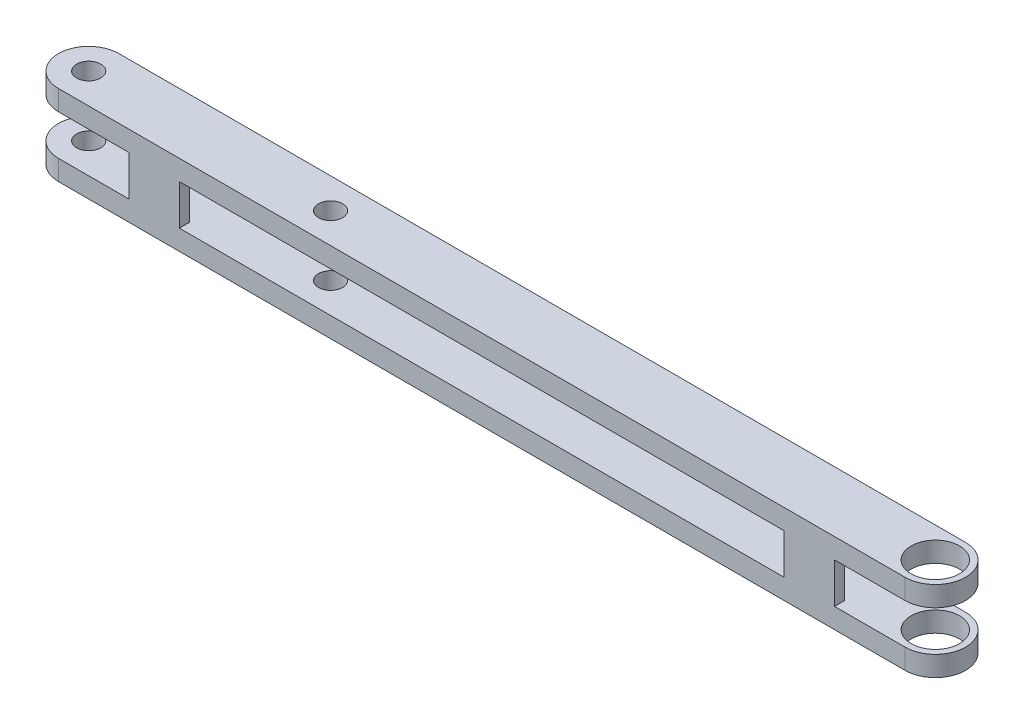
ISO-10303-21;
HEADER;
FILE_DESCRIPTION(('STEP AP214'),'2;1');
FILE_NAME('part.step','',(''),(''),'','','');
FILE_SCHEMA(('AUTOMOTIVE_DESIGN { 1 0 10303 214 1 1 1 1 }'));
ENDSEC;
DATA;
#1=APPLICATION_CONTEXT('core data for automotive mechanical design processes');
#2=APPLICATION_PROTOCOL_DEFINITION('international standard','automotive_design',2000,#1);
#3=PRODUCT_CONTEXT('',#1,'mechanical');
#4=PRODUCT('Part','Part','',(#3));
#5=PRODUCT_RELATED_PRODUCT_CATEGORY('part','',(#4));
#6=PRODUCT_DEFINITION_FORMATION('','',#4);
#7=PRODUCT_DEFINITION_CONTEXT('part definition',#1,'design');
#8=PRODUCT_DEFINITION('design','',#6,#7);
#9=PRODUCT_DEFINITION_SHAPE('','',#8);
#10=(LENGTH_UNIT() NAMED_UNIT(*) SI_UNIT(.MILLI.,.METRE.));
#11=(NAMED_UNIT(*) PLANE_ANGLE_UNIT() SI_UNIT($,.RADIAN.));
#12=(NAMED_UNIT(*) SI_UNIT($,.STERADIAN.) SOLID_ANGLE_UNIT());
#13=UNCERTAINTY_MEASURE_WITH_UNIT(LENGTH_MEASURE(1.E-05),#10,'distance_accuracy_value','');
#14=(GEOMETRIC_REPRESENTATION_CONTEXT(3) GLOBAL_UNCERTAINTY_ASSIGNED_CONTEXT((#13)) GLOBAL_UNIT_ASSIGNED_CONTEXT((#10,
#11,#12)) REPRESENTATION_CONTEXT('',''));
#15=CARTESIAN_POINT('',(0.,0.,0.));
#16=DIRECTION('',(0.,0.,1.));
#17=DIRECTION('',(1.,0.,0.));
#18=AXIS2_PLACEMENT_3D('',#15,#16,#17);
#19=CARTESIAN_POINT('',(75.,4.99999999999999,7.50000000000001));
#20=DIRECTION('',(1.,0.,0.));
#21=DIRECTION('',(0.,0.,-1.));
#22=AXIS2_PLACEMENT_3D('',#19,#20,#21);
#23=PLANE('',#22);
#24=DIRECTION('',(0.,0.,-1.));
#25=VECTOR('',#24,1.);
#26=CARTESIAN_POINT('',(75.,4.99999999999999,7.50000000000001));
#27=LINE('',#26,#25);
#28=CARTESIAN_POINT('',(75.,4.99999999999999,-5.));
#29=VERTEX_POINT('',#28);
#30=CARTESIAN_POINT('',(75.,4.99999999999999,-7.50000000000003));
#31=VERTEX_POINT('',#30);
#32=EDGE_CURVE('E275',#29,#31,#27,.T.);
#33=ORIENTED_EDGE('',*,*,#32,.F.);
#34=DIRECTION('',(0.,1.,0.));
#35=VECTOR('',#34,1.);
#36=CARTESIAN_POINT('',(75.,4.99999999999999,-5.00000000000002));
#37=LINE('',#36,#35);
#38=CARTESIAN_POINT('',(75.,15.,-5.00000000000001));
#39=VERTEX_POINT('',#38);
#40=EDGE_CURVE('E245',#29,#39,#37,.T.);
#41=ORIENTED_EDGE('',*,*,#40,.T.);
#42=DIRECTION('',(0.,0.,-1.));
#43=VECTOR('',#42,1.);
#44=CARTESIAN_POINT('',(75.,15.,7.50000000000001));
#45=LINE('',#44,#43);
#46=CARTESIAN_POINT('',(75.,15.,-7.50000000000003));
#47=VERTEX_POINT('',#46);
#48=EDGE_CURVE('E290',#39,#47,#45,.T.);
#49=ORIENTED_EDGE('',*,*,#48,.T.);
#50=DIRECTION('',(0.,-1.,0.));
#51=VECTOR('',#50,1.);
#52=CARTESIAN_POINT('',(75.,4.99999999999999,-7.50000000000003));
#53=LINE('',#52,#51);
#54=EDGE_CURVE('E261',#47,#31,#53,.T.);
#55=ORIENTED_EDGE('',*,*,#54,.T.);
#56=EDGE_LOOP('',(#33,#41,#49,#55));
#57=FACE_BOUND('',#56,.T.);
#58=ADVANCED_FACE('F35',(#57),#23,.F.);
#59=CARTESIAN_POINT('',(-75.,5.00000000000002,7.50000000000003));
#60=DIRECTION('',(-1.,0.,0.));
#61=DIRECTION('',(0.,0.,1.));
#62=AXIS2_PLACEMENT_3D('',#59,#60,#61);
#63=PLANE('',#62);
#64=DIRECTION('',(0.,0.,-1.));
#65=VECTOR('',#64,1.);
#66=CARTESIAN_POINT('',(-75.,15.,7.50000000000003));
#67=LINE('',#66,#65);
#68=CARTESIAN_POINT('',(-75.,15.,-4.99999999999999));
#69=VERTEX_POINT('',#68);
#70=CARTESIAN_POINT('',(-75.,15.,-7.50000000000001));
#71=VERTEX_POINT('',#70);
#72=EDGE_CURVE('E294',#69,#71,#67,.T.);
#73=ORIENTED_EDGE('',*,*,#72,.F.);
#74=DIRECTION('',(0.,-1.,0.));
#75=VECTOR('',#74,1.);
#76=CARTESIAN_POINT('',(-75.,5.00000000000001,-4.99999999999999));
#77=LINE('',#76,#75);
#78=CARTESIAN_POINT('',(-75.,4.99999999999998,-4.99999999999999));
#79=VERTEX_POINT('',#78);
#80=EDGE_CURVE('E376',#69,#79,#77,.T.);
#81=ORIENTED_EDGE('',*,*,#80,.T.);
#82=DIRECTION('',(0.,0.,-1.));
#83=VECTOR('',#82,1.);
#84=CARTESIAN_POINT('',(-75.,5.00000000000002,7.50000000000003));
#85=LINE('',#84,#83);
#86=CARTESIAN_POINT('',(-75.,5.00000000000002,-7.50000000000001));
#87=VERTEX_POINT('',#86);
#88=EDGE_CURVE('E297',#79,#87,#85,.T.);
#89=ORIENTED_EDGE('',*,*,#88,.T.);
#90=DIRECTION('',(0.,1.,0.));
#91=VECTOR('',#90,1.);
#92=CARTESIAN_POINT('',(-75.,5.00000000000002,-7.50000000000001));
#93=LINE('',#92,#91);
#94=EDGE_CURVE('E281',#87,#71,#93,.T.);
#95=ORIENTED_EDGE('',*,*,#94,.T.);
#96=EDGE_LOOP('',(#73,#81,#89,#95));
#97=FACE_BOUND('',#96,.T.);
#98=ADVANCED_FACE('F461',(#97),#63,.F.);
#99=CARTESIAN_POINT('',(87.5,15.,7.50000000000004));
#100=DIRECTION('',(-1.,0.,0.));
#101=DIRECTION('',(0.,0.,1.));
#102=AXIS2_PLACEMENT_3D('',#99,#100,#101);
#103=PLANE('',#102);
#104=DIRECTION('',(0.,0.,-1.));
#105=VECTOR('',#104,1.);
#106=CARTESIAN_POINT('',(87.5,15.,7.50000000000004));
#107=LINE('',#106,#105);
#108=CARTESIAN_POINT('',(87.5,15.,-5.00000000000002));
#109=VERTEX_POINT('',#108);
#110=CARTESIAN_POINT('',(87.5,15.,-7.50000000000003));
#111=VERTEX_POINT('',#110);
#112=EDGE_CURVE('E252',#109,#111,#107,.T.);
#113=ORIENTED_EDGE('',*,*,#112,.F.);
#114=DIRECTION('',(0.,-1.,0.));
#115=VECTOR('',#114,1.);
#116=CARTESIAN_POINT('',(87.5,15.,-5.00000000000002));
#117=LINE('',#116,#115);
#118=CARTESIAN_POINT('',(87.5,4.99999999999998,-5.00000000000002));
#119=VERTEX_POINT('',#118);
#120=EDGE_CURVE('E373',#109,#119,#117,.T.);
#121=ORIENTED_EDGE('',*,*,#120,.T.);
#122=DIRECTION('',(0.,0.,-1.));
#123=VECTOR('',#122,1.);
#124=CARTESIAN_POINT('',(87.5,4.99999999999998,7.50000000000004));
#125=LINE('',#124,#123);
#126=CARTESIAN_POINT('',(87.5,4.99999999999998,-7.50000000000003));
#127=VERTEX_POINT('',#126);
#128=EDGE_CURVE('E241',#119,#127,#125,.T.);
#129=ORIENTED_EDGE('',*,*,#128,.T.);
#130=DIRECTION('',(0.,1.,0.));
#131=VECTOR('',#130,1.);
#132=CARTESIAN_POINT('',(87.5,15.,-7.50000000000003));
#133=LINE('',#132,#131);
#134=EDGE_CURVE('E235',#127,#111,#133,.T.);
#135=ORIENTED_EDGE('',*,*,#134,.T.);
#136=EDGE_LOOP('',(#113,#121,#129,#135));
#137=FACE_BOUND('',#136,.T.);
#138=ADVANCED_FACE('F467',(#137),#103,.F.);
#139=CARTESIAN_POINT('',(-87.5,15.,7.50000000000007));
#140=DIRECTION('',(1.,0.,0.));
#141=DIRECTION('',(0.,0.,-1.));
#142=AXIS2_PLACEMENT_3D('',#139,#140,#141);
#143=PLANE('',#142);
#144=DIRECTION('',(0.,0.,-1.));
#145=VECTOR('',#144,1.);
#146=CARTESIAN_POINT('',(-87.5,4.99999999999998,7.50000000000007));
#147=LINE('',#146,#145);
#148=CARTESIAN_POINT('',(-87.5,4.99999999999998,-5.00000000000002));
#149=VERTEX_POINT('',#148);
#150=CARTESIAN_POINT('',(-87.5,4.99999999999998,-7.5));
#151=VERTEX_POINT('',#150);
#152=EDGE_CURVE('E221',#149,#151,#147,.T.);
#153=ORIENTED_EDGE('',*,*,#152,.F.);
#154=DIRECTION('',(0.,-1.,0.));
#155=VECTOR('',#154,1.);
#156=CARTESIAN_POINT('',(-87.5,15.,-4.99999999999998));
#157=LINE('',#156,#155);
#158=CARTESIAN_POINT('',(-87.5,15.,-4.99999999999998));
#159=VERTEX_POINT('',#158);
#160=EDGE_CURVE('E213',#159,#149,#157,.T.);
#161=ORIENTED_EDGE('',*,*,#160,.F.);
#162=DIRECTION('',(0.,0.,-1.));
#163=VECTOR('',#162,1.);
#164=CARTESIAN_POINT('',(-87.5,15.,7.50000000000007));
#165=LINE('',#164,#163);
#166=CARTESIAN_POINT('',(-87.5,15.,-7.5));
#167=VERTEX_POINT('',#166);
#168=EDGE_CURVE('E230',#159,#167,#165,.T.);
#169=ORIENTED_EDGE('',*,*,#168,.T.);
#170=DIRECTION('',(0.,-1.,0.));
#171=VECTOR('',#170,1.);
#172=CARTESIAN_POINT('',(-87.5,15.,-7.5));
#173=LINE('',#172,#171);
#174=EDGE_CURVE('E251',#167,#151,#173,.T.);
#175=ORIENTED_EDGE('',*,*,#174,.T.);
#176=EDGE_LOOP('',(#153,#161,#169,#175));
#177=FACE_BOUND('',#176,.T.);
#178=ADVANCED_FACE('F501',(#177),#143,.F.);
#179=CARTESIAN_POINT('',(-105.,20.,0.));
#180=DIRECTION('',(0.,-1.,0.));
#181=DIRECTION('',(0.,0.,-1.));
#182=AXIS2_PLACEMENT_3D('',#179,#180,#181);
#183=CYLINDRICAL_SURFACE('',#182,7.5);
#184=DIRECTION('',(0.,-1.,0.));
#185=VECTOR('',#184,1.);
#186=CARTESIAN_POINT('',(-105.,20.,7.5));
#187=LINE('',#186,#185);
#188=CARTESIAN_POINT('',(-105.,4.99999999999998,7.50000000000007));
#189=VERTEX_POINT('',#188);
#190=CARTESIAN_POINT('',(-105.,0.,7.5));
#191=VERTEX_POINT('',#190);
#192=EDGE_CURVE('E332',#189,#191,#187,.T.);
#193=ORIENTED_EDGE('',*,*,#192,.F.);
#194=CARTESIAN_POINT('',(-105.,4.99999999999998,0.));
#195=DIRECTION('',(0.,-1.,0.));
#196=DIRECTION('',(1.,0.,0.));
#197=AXIS2_PLACEMENT_3D('',#194,#195,#196);
#198=CIRCLE('',#197,7.5);
#199=CARTESIAN_POINT('',(-105.,4.99999999999998,-7.5));
#200=VERTEX_POINT('',#199);
#201=EDGE_CURVE('E259',#189,#200,#198,.T.);
#202=ORIENTED_EDGE('',*,*,#201,.T.);
#203=DIRECTION('',(0.,-1.,0.));
#204=VECTOR('',#203,1.);
#205=CARTESIAN_POINT('',(-105.,20.,-7.5));
#206=LINE('',#205,#204);
#207=CARTESIAN_POINT('',(-105.,0.,-7.5));
#208=VERTEX_POINT('',#207);
#209=EDGE_CURVE('E310',#200,#208,#206,.T.);
#210=ORIENTED_EDGE('',*,*,#209,.T.);
#211=CARTESIAN_POINT('',(-105.,0.,0.));
#212=DIRECTION('',(0.,1.,0.));
#213=DIRECTION('',(0.,0.,1.));
#214=AXIS2_PLACEMENT_3D('',#211,#212,#213);
#215=CIRCLE('',#214,7.5);
#216=EDGE_CURVE('E289',#208,#191,#215,.T.);
#217=ORIENTED_EDGE('',*,*,#216,.T.);
#218=EDGE_LOOP('',(#193,#202,#210,#217));
#219=FACE_BOUND('',#218,.T.);
#220=ADVANCED_FACE('F399',(#219),#183,.T.);
#221=CARTESIAN_POINT('',(105.,20.,0.));
#222=DIRECTION('',(0.,-1.,0.));
#223=DIRECTION('',(0.,0.,-1.));
#224=AXIS2_PLACEMENT_3D('',#221,#222,#223);
#225=CYLINDRICAL_SURFACE('',#224,7.5);
#226=DIRECTION('',(0.,-1.,0.));
#227=VECTOR('',#226,1.);
#228=CARTESIAN_POINT('',(105.,20.,7.49999999999996));
#229=LINE('',#228,#227);
#230=CARTESIAN_POINT('',(105.,20.,7.49999999999996));
#231=VERTEX_POINT('',#230);
#232=CARTESIAN_POINT('',(105.,15.,7.50000000000004));
#233=VERTEX_POINT('',#232);
#234=EDGE_CURVE('E329',#231,#233,#229,.T.);
#235=ORIENTED_EDGE('',*,*,#234,.T.);
#236=CARTESIAN_POINT('',(105.,15.,0.));
#237=DIRECTION('',(0.,1.,0.));
#238=DIRECTION('',(-1.,0.,0.));
#239=AXIS2_PLACEMENT_3D('',#236,#237,#238);
#240=CIRCLE('',#239,7.5);
#241=CARTESIAN_POINT('',(105.,15.,-7.50000000000004));
#242=VERTEX_POINT('',#241);
#243=EDGE_CURVE('E223',#233,#242,#240,.T.);
#244=ORIENTED_EDGE('',*,*,#243,.T.);
#245=DIRECTION('',(0.,-1.,0.));
#246=VECTOR('',#245,1.);
#247=CARTESIAN_POINT('',(105.,20.,-7.50000000000004));
#248=LINE('',#247,#246);
#249=CARTESIAN_POINT('',(105.,20.,-7.50000000000004));
#250=VERTEX_POINT('',#249);
#251=EDGE_CURVE('E325',#250,#242,#248,.T.);
#252=ORIENTED_EDGE('',*,*,#251,.F.);
#253=CARTESIAN_POINT('',(105.,20.,0.));
#254=DIRECTION('',(0.,1.,0.));
#255=DIRECTION('',(0.,0.,1.));
#256=AXIS2_PLACEMENT_3D('',#253,#254,#255);
#257=CIRCLE('',#256,7.5);
#258=EDGE_CURVE('E306',#231,#250,#257,.T.);
#259=ORIENTED_EDGE('',*,*,#258,.F.);
#260=EDGE_LOOP('',(#235,#244,#252,#259));
#261=FACE_BOUND('',#260,.T.);
#262=ADVANCED_FACE('F423',(#261),#225,.T.);
#263=CARTESIAN_POINT('',(-105.,15.,0.));
#264=DIRECTION('',(0.,1.,0.));
#265=DIRECTION('',(-1.,0.,0.));
#266=AXIS2_PLACEMENT_3D('',#263,#264,#265);
#267=CIRCLE('',#266,7.5);
#268=CARTESIAN_POINT('',(-105.,15.,-7.5));
#269=VERTEX_POINT('',#268);
#270=CARTESIAN_POINT('',(-105.,15.,7.50000000000007));
#271=VERTEX_POINT('',#270);
#272=EDGE_CURVE('E257',#269,#271,#267,.T.);
#273=ORIENTED_EDGE('',*,*,#272,.T.);
#274=CARTESIAN_POINT('',(-105.,20.,7.5));
#275=VERTEX_POINT('',#274);
#276=EDGE_CURVE('E333',#275,#271,#187,.T.);
#277=ORIENTED_EDGE('',*,*,#276,.F.);
#278=CARTESIAN_POINT('',(-105.,20.,0.));
#279=DIRECTION('',(0.,1.,0.));
#280=DIRECTION('',(0.,0.,1.));
#281=AXIS2_PLACEMENT_3D('',#278,#279,#280);
#282=CIRCLE('',#281,7.5);
#283=CARTESIAN_POINT('',(-105.,20.,-7.5));
#284=VERTEX_POINT('',#283);
#285=EDGE_CURVE('E300',#284,#275,#282,.T.);
#286=ORIENTED_EDGE('',*,*,#285,.F.);
#287=EDGE_CURVE('E321',#284,#269,#206,.T.);
#288=ORIENTED_EDGE('',*,*,#287,.T.);
#289=EDGE_LOOP('',(#273,#277,#286,#288));
#290=FACE_BOUND('',#289,.T.);
#291=ADVANCED_FACE('F37',(#290),#183,.T.);
#292=CARTESIAN_POINT('',(-105.,20.,7.5));
#293=DIRECTION('',(0.,0.,-1.));
#294=DIRECTION('',(-1.,0.,0.));
#295=AXIS2_PLACEMENT_3D('',#292,#293,#294);
#296=PLANE('',#295);
#297=DIRECTION('',(1.,0.,0.));
#298=VECTOR('',#297,1.);
#299=CARTESIAN_POINT('',(-75.,15.,7.50000000000003));
#300=LINE('',#299,#298);
#301=CARTESIAN_POINT('',(-75.,15.,7.50000000000003));
#302=VERTEX_POINT('',#301);
#303=CARTESIAN_POINT('',(75.,15.,7.50000000000001));
#304=VERTEX_POINT('',#303);
#305=EDGE_CURVE('E272',#302,#304,#300,.T.);
#306=ORIENTED_EDGE('',*,*,#305,.T.);
#307=DIRECTION('',(0.,-1.,0.));
#308=VECTOR('',#307,1.);
#309=CARTESIAN_POINT('',(75.,4.99999999999999,7.50000000000001));
#310=LINE('',#309,#308);
#311=CARTESIAN_POINT('',(75.,4.99999999999999,7.50000000000001));
#312=VERTEX_POINT('',#311);
#313=EDGE_CURVE('E262',#304,#312,#310,.T.);
#314=ORIENTED_EDGE('',*,*,#313,.T.);
#315=DIRECTION('',(-1.,0.,0.));
#316=VECTOR('',#315,1.);
#317=CARTESIAN_POINT('',(-75.,5.00000000000002,7.50000000000003));
#318=LINE('',#317,#316);
#319=CARTESIAN_POINT('',(-75.,5.00000000000002,7.49999999999999));
#320=VERTEX_POINT('',#319);
#321=EDGE_CURVE('E265',#312,#320,#318,.T.);
#322=ORIENTED_EDGE('',*,*,#321,.T.);
#323=DIRECTION('',(0.,1.,0.));
#324=VECTOR('',#323,1.);
#325=CARTESIAN_POINT('',(-75.,5.00000000000002,7.50000000000003));
#326=LINE('',#325,#324);
#327=EDGE_CURVE('E269',#320,#302,#326,.T.);
#328=ORIENTED_EDGE('',*,*,#327,.T.);
#329=EDGE_LOOP('',(#306,#314,#322,#328));
#330=FACE_BOUND('',#329,.T.);
#331=DIRECTION('',(0.,-1.,0.));
#332=VECTOR('',#331,1.);
#333=CARTESIAN_POINT('',(-87.5,15.,7.50000000000007));
#334=LINE('',#333,#332);
#335=CARTESIAN_POINT('',(-87.5,15.,7.50000000000007));
#336=VERTEX_POINT('',#335);
#337=CARTESIAN_POINT('',(-87.5,4.99999999999998,7.50000000000007));
#338=VERTEX_POINT('',#337);
#339=EDGE_CURVE('E384',#336,#338,#334,.T.);
#340=ORIENTED_EDGE('',*,*,#339,.T.);
#341=DIRECTION('',(-1.,0.,0.));
#342=VECTOR('',#341,1.);
#343=CARTESIAN_POINT('',(-112.5,4.99999999999998,7.50000000000008));
#344=LINE('',#343,#342);
#345=EDGE_CURVE('E218',#338,#189,#344,.T.);
#346=ORIENTED_EDGE('',*,*,#345,.T.);
#347=ORIENTED_EDGE('',*,*,#192,.T.);
#348=DIRECTION('',(1.,0.,0.));
#349=VECTOR('',#348,1.);
#350=CARTESIAN_POINT('',(-105.,0.,7.5));
#351=LINE('',#350,#349);
#352=CARTESIAN_POINT('',(105.,0.,7.49999999999996));
#353=VERTEX_POINT('',#352);
#354=EDGE_CURVE('E313',#191,#353,#351,.T.);
#355=ORIENTED_EDGE('',*,*,#354,.T.);
#356=CARTESIAN_POINT('',(105.,4.99999999999998,7.50000000000004));
#357=VERTEX_POINT('',#356);
#358=EDGE_CURVE('E328',#357,#353,#229,.T.);
#359=ORIENTED_EDGE('',*,*,#358,.F.);
#360=DIRECTION('',(-1.,0.,0.));
#361=VECTOR('',#360,1.);
#362=CARTESIAN_POINT('',(112.5,4.99999999999998,7.50000000000003));
#363=LINE('',#362,#361);
#364=CARTESIAN_POINT('',(87.5,4.99999999999998,7.50000000000004));
#365=VERTEX_POINT('',#364);
#366=EDGE_CURVE('E234',#357,#365,#363,.T.);
#367=ORIENTED_EDGE('',*,*,#366,.T.);
#368=DIRECTION('',(0.,1.,0.));
#369=VECTOR('',#368,1.);
#370=CARTESIAN_POINT('',(87.5,15.,7.50000000000004));
#371=LINE('',#370,#369);
#372=CARTESIAN_POINT('',(87.5,15.,7.50000000000004));
#373=VERTEX_POINT('',#372);
#374=EDGE_CURVE('E238',#365,#373,#371,.T.);
#375=ORIENTED_EDGE('',*,*,#374,.T.);
#376=DIRECTION('',(1.,0.,0.));
#377=VECTOR('',#376,1.);
#378=CARTESIAN_POINT('',(112.5,15.,7.50000000000003));
#379=LINE('',#378,#377);
#380=EDGE_CURVE('E231',#373,#233,#379,.T.);
#381=ORIENTED_EDGE('',*,*,#380,.T.);
#382=ORIENTED_EDGE('',*,*,#234,.F.);
#383=DIRECTION('',(1.,0.,0.));
#384=VECTOR('',#383,1.);
#385=CARTESIAN_POINT('',(-105.,20.,7.5));
#386=LINE('',#385,#384);
#387=EDGE_CURVE('E303',#275,#231,#386,.T.);
#388=ORIENTED_EDGE('',*,*,#387,.F.);
#389=ORIENTED_EDGE('',*,*,#276,.T.);
#390=DIRECTION('',(1.,0.,0.));
#391=VECTOR('',#390,1.);
#392=CARTESIAN_POINT('',(-112.5,15.,7.50000000000008));
#393=LINE('',#392,#391);
#394=EDGE_CURVE('E381',#271,#336,#393,.T.);
#395=ORIENTED_EDGE('',*,*,#394,.T.);
#396=EDGE_LOOP('',(#340,#346,#347,#355,#359,#367,#375,#381,#382,#388,#389,#395));
#397=FACE_BOUND('',#396,.T.);
#398=ADVANCED_FACE('F402',(#330,#397),#296,.F.);
#399=CARTESIAN_POINT('',(105.,4.99999999999998,0.));
#400=DIRECTION('',(0.,-1.,0.));
#401=DIRECTION('',(1.,0.,0.));
#402=AXIS2_PLACEMENT_3D('',#399,#400,#401);
#403=CIRCLE('',#402,7.5);
#404=CARTESIAN_POINT('',(105.,4.99999999999998,-7.50000000000004));
#405=VERTEX_POINT('',#404);
#406=EDGE_CURVE('E220',#405,#357,#403,.T.);
#407=ORIENTED_EDGE('',*,*,#406,.T.);
#408=ORIENTED_EDGE('',*,*,#358,.T.);
#409=CARTESIAN_POINT('',(105.,0.,0.));
#410=DIRECTION('',(0.,1.,0.));
#411=DIRECTION('',(0.,0.,1.));
#412=AXIS2_PLACEMENT_3D('',#409,#410,#411);
#413=CIRCLE('',#412,7.5);
#414=CARTESIAN_POINT('',(105.,0.,-7.50000000000004));
#415=VERTEX_POINT('',#414);
#416=EDGE_CURVE('E316',#353,#415,#413,.T.);
#417=ORIENTED_EDGE('',*,*,#416,.T.);
#418=EDGE_CURVE('E324',#405,#415,#248,.T.);
#419=ORIENTED_EDGE('',*,*,#418,.F.);
#420=EDGE_LOOP('',(#407,#408,#417,#419));
#421=FACE_BOUND('',#420,.T.);
#422=ADVANCED_FACE('F409',(#421),#225,.T.);
#423=CARTESIAN_POINT('',(-105.,20.,-7.5));
#424=DIRECTION('',(0.,0.,1.));
#425=DIRECTION('',(1.,0.,0.));
#426=AXIS2_PLACEMENT_3D('',#423,#424,#425);
#427=PLANE('',#426);
#428=DIRECTION('',(-1.,0.,0.));
#429=VECTOR('',#428,1.);
#430=CARTESIAN_POINT('',(-75.,5.00000000000002,-7.50000000000001));
#431=LINE('',#430,#429);
#432=EDGE_CURVE('E278',#31,#87,#431,.T.);
#433=ORIENTED_EDGE('',*,*,#432,.F.);
#434=ORIENTED_EDGE('',*,*,#54,.F.);
#435=DIRECTION('',(1.,0.,0.));
#436=VECTOR('',#435,1.);
#437=CARTESIAN_POINT('',(-75.,15.,-7.50000000000001));
#438=LINE('',#437,#436);
#439=EDGE_CURVE('E266',#71,#47,#438,.T.);
#440=ORIENTED_EDGE('',*,*,#439,.F.);
#441=ORIENTED_EDGE('',*,*,#94,.F.);
#442=EDGE_LOOP('',(#433,#434,#440,#441));
#443=FACE_BOUND('',#442,.T.);
#444=ORIENTED_EDGE('',*,*,#209,.F.);
#445=DIRECTION('',(-1.,0.,0.));
#446=VECTOR('',#445,1.);
#447=CARTESIAN_POINT('',(-112.5,4.99999999999998,-7.5));
#448=LINE('',#447,#446);
#449=EDGE_CURVE('E227',#151,#200,#448,.T.);
#450=ORIENTED_EDGE('',*,*,#449,.F.);
#451=ORIENTED_EDGE('',*,*,#174,.F.);
#452=DIRECTION('',(-1.,0.,0.));
#453=VECTOR('',#452,1.);
#454=CARTESIAN_POINT('',(-105.,15.,-7.5));
#455=LINE('',#454,#453);
#456=EDGE_CURVE('E11',#167,#269,#455,.T.);
#457=ORIENTED_EDGE('',*,*,#456,.T.);
#458=ORIENTED_EDGE('',*,*,#287,.F.);
#459=DIRECTION('',(-1.,0.,0.));
#460=VECTOR('',#459,1.);
#461=CARTESIAN_POINT('',(-105.,20.,-7.5));
#462=LINE('',#461,#460);
#463=EDGE_CURVE('E308',#250,#284,#462,.T.);
#464=ORIENTED_EDGE('',*,*,#463,.F.);
#465=ORIENTED_EDGE('',*,*,#251,.T.);
#466=DIRECTION('',(1.,0.,0.));
#467=VECTOR('',#466,1.);
#468=CARTESIAN_POINT('',(112.5,15.,-7.50000000000004));
#469=LINE('',#468,#467);
#470=EDGE_CURVE('E242',#111,#242,#469,.T.);
#471=ORIENTED_EDGE('',*,*,#470,.F.);
#472=ORIENTED_EDGE('',*,*,#134,.F.);
#473=DIRECTION('',(1.,0.,0.));
#474=VECTOR('',#473,1.);
#475=CARTESIAN_POINT('',(-105.,5.00000000000001,-7.5));
#476=LINE('',#475,#474);
#477=EDGE_CURVE('E44',#127,#405,#476,.T.);
#478=ORIENTED_EDGE('',*,*,#477,.T.);
#479=ORIENTED_EDGE('',*,*,#418,.T.);
#480=DIRECTION('',(-1.,0.,0.));
#481=VECTOR('',#480,1.);
#482=CARTESIAN_POINT('',(-105.,0.,-7.5));
#483=LINE('',#482,#481);
#484=EDGE_CURVE('E304',#415,#208,#483,.T.);
#485=ORIENTED_EDGE('',*,*,#484,.T.);
#486=EDGE_LOOP('',(#444,#450,#451,#457,#458,#464,#465,#471,#472,#478,#479,#485));
#487=FACE_BOUND('',#486,.T.);
#488=ADVANCED_FACE('F394',(#443,#487),#427,.F.);
#489=CARTESIAN_POINT('',(-105.,20.,0.));
#490=DIRECTION('',(0.,1.,0.));
#491=DIRECTION('',(0.,0.,1.));
#492=AXIS2_PLACEMENT_3D('',#489,#490,#491);
#493=PLANE('',#492);
#494=CARTESIAN_POINT('',(-44.9999999999958,20.,0.));
#495=DIRECTION('',(0.,1.,0.));
#496=DIRECTION('',(0.,0.,1.));
#497=AXIS2_PLACEMENT_3D('',#494,#495,#496);
#498=CIRCLE('',#497,3.);
#499=CARTESIAN_POINT('',(-44.9999999999958,20.,3.));
#500=VERTEX_POINT('',#499);
#501=EDGE_CURVE('E583',#500,#500,#498,.T.);
#502=ORIENTED_EDGE('',*,*,#501,.F.);
#503=EDGE_LOOP('',(#502));
#504=FACE_BOUND('',#503,.T.);
#505=CARTESIAN_POINT('',(-105.,20.,0.));
#506=DIRECTION('',(0.,1.,0.));
#507=DIRECTION('',(0.,0.,1.));
#508=AXIS2_PLACEMENT_3D('',#505,#506,#507);
#509=CIRCLE('',#508,3.00000000000001);
#510=CARTESIAN_POINT('',(-105.,20.,3.00000000000001));
#511=VERTEX_POINT('',#510);
#512=EDGE_CURVE('E575',#511,#511,#509,.T.);
#513=ORIENTED_EDGE('',*,*,#512,.F.);
#514=EDGE_LOOP('',(#513));
#515=FACE_BOUND('',#514,.T.);
#516=CARTESIAN_POINT('',(105.,20.,0.));
#517=DIRECTION('',(0.,1.,0.));
#518=DIRECTION('',(0.,0.,1.));
#519=AXIS2_PLACEMENT_3D('',#516,#517,#518);
#520=CIRCLE('',#519,6.);
#521=CARTESIAN_POINT('',(105.,20.,6.));
#522=VERTEX_POINT('',#521);
#523=EDGE_CURVE('E354',#522,#522,#520,.T.);
#524=ORIENTED_EDGE('',*,*,#523,.F.);
#525=EDGE_LOOP('',(#524));
#526=FACE_BOUND('',#525,.T.);
#527=ORIENTED_EDGE('',*,*,#285,.T.);
#528=ORIENTED_EDGE('',*,*,#387,.T.);
#529=ORIENTED_EDGE('',*,*,#258,.T.);
#530=ORIENTED_EDGE('',*,*,#463,.T.);
#531=EDGE_LOOP('',(#527,#528,#529,#530));
#532=FACE_BOUND('',#531,.T.);
#533=ADVANCED_FACE('F427',(#504,#515,#526,#532),#493,.T.);
#534=CARTESIAN_POINT('',(-105.,0.,0.));
#535=DIRECTION('',(0.,1.,0.));
#536=DIRECTION('',(0.,0.,1.));
#537=AXIS2_PLACEMENT_3D('',#534,#535,#536);
#538=PLANE('',#537);
#539=CARTESIAN_POINT('',(-44.9999999999958,0.,0.));
#540=DIRECTION('',(0.,1.,0.));
#541=DIRECTION('',(0.,0.,1.));
#542=AXIS2_PLACEMENT_3D('',#539,#540,#541);
#543=CIRCLE('',#542,3.);
#544=CARTESIAN_POINT('',(-44.9999999999958,0.,3.));
#545=VERTEX_POINT('',#544);
#546=EDGE_CURVE('E580',#545,#545,#543,.T.);
#547=ORIENTED_EDGE('',*,*,#546,.T.);
#548=EDGE_LOOP('',(#547));
#549=FACE_BOUND('',#548,.T.);
#550=CARTESIAN_POINT('',(-105.,0.,0.));
#551=DIRECTION('',(0.,1.,0.));
#552=DIRECTION('',(0.,0.,1.));
#553=AXIS2_PLACEMENT_3D('',#550,#551,#552);
#554=CIRCLE('',#553,3.00000000000001);
#555=CARTESIAN_POINT('',(-105.,0.,3.00000000000001));
#556=VERTEX_POINT('',#555);
#557=EDGE_CURVE('E341',#556,#556,#554,.T.);
#558=ORIENTED_EDGE('',*,*,#557,.T.);
#559=EDGE_LOOP('',(#558));
#560=FACE_BOUND('',#559,.T.);
#561=CARTESIAN_POINT('',(105.,0.,0.));
#562=DIRECTION('',(0.,1.,0.));
#563=DIRECTION('',(0.,0.,1.));
#564=AXIS2_PLACEMENT_3D('',#561,#562,#563);
#565=CIRCLE('',#564,6.);
#566=CARTESIAN_POINT('',(105.,0.,6.));
#567=VERTEX_POINT('',#566);
#568=EDGE_CURVE('E572',#567,#567,#565,.T.);
#569=ORIENTED_EDGE('',*,*,#568,.T.);
#570=EDGE_LOOP('',(#569));
#571=FACE_BOUND('',#570,.T.);
#572=ORIENTED_EDGE('',*,*,#216,.F.);
#573=ORIENTED_EDGE('',*,*,#484,.F.);
#574=ORIENTED_EDGE('',*,*,#416,.F.);
#575=ORIENTED_EDGE('',*,*,#354,.F.);
#576=EDGE_LOOP('',(#572,#573,#574,#575));
#577=FACE_BOUND('',#576,.T.);
#578=ADVANCED_FACE('F406',(#549,#560,#571,#577),#538,.F.);
#579=CARTESIAN_POINT('',(75.,15.,4.99999999999999));
#580=VERTEX_POINT('',#579);
#581=EDGE_CURVE('E286',#304,#580,#45,.T.);
#582=ORIENTED_EDGE('',*,*,#581,.T.);
#583=DIRECTION('',(0.,-1.,0.));
#584=VECTOR('',#583,1.);
#585=CARTESIAN_POINT('',(75.,4.99999999999999,4.99999999999999));
#586=LINE('',#585,#584);
#587=CARTESIAN_POINT('',(75.,4.99999999999998,4.99999999999999));
#588=VERTEX_POINT('',#587);
#589=EDGE_CURVE('E370',#580,#588,#586,.T.);
#590=ORIENTED_EDGE('',*,*,#589,.T.);
#591=EDGE_CURVE('E298',#312,#588,#27,.T.);
#592=ORIENTED_EDGE('',*,*,#591,.F.);
#593=ORIENTED_EDGE('',*,*,#313,.F.);
#594=EDGE_LOOP('',(#582,#590,#592,#593));
#595=FACE_BOUND('',#594,.T.);
#596=ADVANCED_FACE('F441',(#595),#23,.F.);
#597=CARTESIAN_POINT('',(-75.,15.,7.50000000000003));
#598=DIRECTION('',(0.,1.,0.));
#599=DIRECTION('',(-1.,0.,0.));
#600=AXIS2_PLACEMENT_3D('',#597,#598,#599);
#601=PLANE('',#600);
#602=CARTESIAN_POINT('',(-44.9999999999958,15.,0.));
#603=DIRECTION('',(0.,1.,0.));
#604=DIRECTION('',(-1.,0.,0.));
#605=AXIS2_PLACEMENT_3D('',#602,#603,#604);
#606=CIRCLE('',#605,3.);
#607=CARTESIAN_POINT('',(-47.9999999999958,15.,0.));
#608=VERTEX_POINT('',#607);
#609=EDGE_CURVE('E573',#608,#608,#606,.T.);
#610=ORIENTED_EDGE('',*,*,#609,.T.);
#611=EDGE_LOOP('',(#610));
#612=FACE_BOUND('',#611,.T.);
#613=CARTESIAN_POINT('',(-105.,15.,0.));
#614=DIRECTION('',(0.,1.,0.));
#615=DIRECTION('',(-1.,0.,0.));
#616=AXIS2_PLACEMENT_3D('',#613,#614,#615);
#617=CIRCLE('',#616,3.00000000000001);
#618=CARTESIAN_POINT('',(-108.,15.,0.));
#619=VERTEX_POINT('',#618);
#620=EDGE_CURVE('E344',#619,#619,#617,.T.);
#621=ORIENTED_EDGE('',*,*,#620,.T.);
#622=EDGE_LOOP('',(#621));
#623=FACE_BOUND('',#622,.T.);
#624=CARTESIAN_POINT('',(105.,15.,0.));
#625=DIRECTION('',(0.,1.,0.));
#626=DIRECTION('',(-1.,0.,0.));
#627=AXIS2_PLACEMENT_3D('',#624,#625,#626);
#628=CIRCLE('',#627,6.);
#629=CARTESIAN_POINT('',(99.,15.,0.));
#630=VERTEX_POINT('',#629);
#631=EDGE_CURVE('E340',#630,#630,#628,.T.);
#632=ORIENTED_EDGE('',*,*,#631,.T.);
#633=EDGE_LOOP('',(#632));
#634=FACE_BOUND('',#633,.T.);
#635=CARTESIAN_POINT('',(-75.,15.,5.00000000000001));
#636=VERTEX_POINT('',#635);
#637=EDGE_CURVE('E291',#302,#636,#67,.T.);
#638=ORIENTED_EDGE('',*,*,#637,.T.);
#639=DIRECTION('',(-1.,0.,0.));
#640=VECTOR('',#639,1.);
#641=CARTESIAN_POINT('',(112.5,15.,4.99999999999998));
#642=LINE('',#641,#640);
#643=CARTESIAN_POINT('',(-87.5,15.,5.00000000000002));
#644=VERTEX_POINT('',#643);
#645=EDGE_CURVE('E362',#636,#644,#642,.T.);
#646=ORIENTED_EDGE('',*,*,#645,.T.);
#647=EDGE_CURVE('E211',#336,#644,#165,.T.);
#648=ORIENTED_EDGE('',*,*,#647,.F.);
#649=ORIENTED_EDGE('',*,*,#394,.F.);
#650=ORIENTED_EDGE('',*,*,#272,.F.);
#651=ORIENTED_EDGE('',*,*,#456,.F.);
#652=ORIENTED_EDGE('',*,*,#168,.F.);
#653=DIRECTION('',(-1.,0.,0.));
#654=VECTOR('',#653,1.);
#655=CARTESIAN_POINT('',(112.5,15.,-5.00000000000002));
#656=LINE('',#655,#654);
#657=EDGE_CURVE('E358',#69,#159,#656,.T.);
#658=ORIENTED_EDGE('',*,*,#657,.F.);
#659=ORIENTED_EDGE('',*,*,#72,.T.);
#660=ORIENTED_EDGE('',*,*,#439,.T.);
#661=ORIENTED_EDGE('',*,*,#48,.F.);
#662=EDGE_CURVE('E360',#109,#39,#656,.T.);
#663=ORIENTED_EDGE('',*,*,#662,.F.);
#664=ORIENTED_EDGE('',*,*,#112,.T.);
#665=ORIENTED_EDGE('',*,*,#470,.T.);
#666=ORIENTED_EDGE('',*,*,#243,.F.);
#667=ORIENTED_EDGE('',*,*,#380,.F.);
#668=CARTESIAN_POINT('',(87.5,15.,4.99999999999998));
#669=VERTEX_POINT('',#668);
#670=EDGE_CURVE('E248',#373,#669,#107,.T.);
#671=ORIENTED_EDGE('',*,*,#670,.T.);
#672=EDGE_CURVE('E361',#669,#580,#642,.T.);
#673=ORIENTED_EDGE('',*,*,#672,.T.);
#674=ORIENTED_EDGE('',*,*,#581,.F.);
#675=ORIENTED_EDGE('',*,*,#305,.F.);
#676=EDGE_LOOP('',(#638,#646,#648,#649,#650,#651,#652,#658,#659,#660,#661,#663,#664,#665,#666,
#667,#671,#673,#674,#675));
#677=FACE_BOUND('',#676,.T.);
#678=ADVANCED_FACE('F419',(#612,#623,#634,#677),#601,.F.);
#679=CARTESIAN_POINT('',(-75.,5.00000000000002,5.));
#680=VERTEX_POINT('',#679);
#681=EDGE_CURVE('E295',#320,#680,#85,.T.);
#682=ORIENTED_EDGE('',*,*,#681,.T.);
#683=DIRECTION('',(0.,1.,0.));
#684=VECTOR('',#683,1.);
#685=CARTESIAN_POINT('',(-75.,5.00000000000002,5.00000000000002));
#686=LINE('',#685,#684);
#687=EDGE_CURVE('E202',#680,#636,#686,.T.);
#688=ORIENTED_EDGE('',*,*,#687,.T.);
#689=ORIENTED_EDGE('',*,*,#637,.F.);
#690=ORIENTED_EDGE('',*,*,#327,.F.);
#691=EDGE_LOOP('',(#682,#688,#689,#690));
#692=FACE_BOUND('',#691,.T.);
#693=ADVANCED_FACE('F436',(#692),#63,.F.);
#694=CARTESIAN_POINT('',(-75.,5.00000000000002,7.50000000000003));
#695=DIRECTION('',(0.,-1.,0.));
#696=DIRECTION('',(1.,0.,0.));
#697=AXIS2_PLACEMENT_3D('',#694,#695,#696);
#698=PLANE('',#697);
#699=CARTESIAN_POINT('',(-44.9999999999958,5.00000000000001,0.));
#700=DIRECTION('',(0.,-1.,0.));
#701=DIRECTION('',(1.,0.,0.));
#702=AXIS2_PLACEMENT_3D('',#699,#700,#701);
#703=CIRCLE('',#702,3.);
#704=CARTESIAN_POINT('',(-41.9999999999958,5.00000000000001,0.));
#705=VERTEX_POINT('',#704);
#706=EDGE_CURVE('E39',#705,#705,#703,.T.);
#707=ORIENTED_EDGE('',*,*,#706,.T.);
#708=EDGE_LOOP('',(#707));
#709=FACE_BOUND('',#708,.T.);
#710=CARTESIAN_POINT('',(-105.,5.00000000000002,0.));
#711=DIRECTION('',(0.,-1.,0.));
#712=DIRECTION('',(1.,0.,0.));
#713=AXIS2_PLACEMENT_3D('',#710,#711,#712);
#714=CIRCLE('',#713,3.00000000000001);
#715=CARTESIAN_POINT('',(-102.,5.00000000000002,0.));
#716=VERTEX_POINT('',#715);
#717=EDGE_CURVE('E342',#716,#716,#714,.T.);
#718=ORIENTED_EDGE('',*,*,#717,.T.);
#719=EDGE_LOOP('',(#718));
#720=FACE_BOUND('',#719,.T.);
#721=CARTESIAN_POINT('',(105.,4.99999999999998,0.));
#722=DIRECTION('',(0.,-1.,0.));
#723=DIRECTION('',(1.,0.,0.));
#724=AXIS2_PLACEMENT_3D('',#721,#722,#723);
#725=CIRCLE('',#724,6.);
#726=CARTESIAN_POINT('',(111.,4.99999999999998,0.));
#727=VERTEX_POINT('',#726);
#728=EDGE_CURVE('E338',#727,#727,#725,.T.);
#729=ORIENTED_EDGE('',*,*,#728,.T.);
#730=EDGE_LOOP('',(#729));
#731=FACE_BOUND('',#730,.T.);
#732=ORIENTED_EDGE('',*,*,#591,.T.);
#733=DIRECTION('',(-1.,0.,0.));
#734=VECTOR('',#733,1.);
#735=CARTESIAN_POINT('',(112.5,4.99999999999998,4.99999999999998));
#736=LINE('',#735,#734);
#737=CARTESIAN_POINT('',(87.5,4.99999999999998,5.00000000000002));
#738=VERTEX_POINT('',#737);
#739=EDGE_CURVE('E204',#738,#588,#736,.T.);
#740=ORIENTED_EDGE('',*,*,#739,.F.);
#741=EDGE_CURVE('E253',#365,#738,#125,.T.);
#742=ORIENTED_EDGE('',*,*,#741,.F.);
#743=ORIENTED_EDGE('',*,*,#366,.F.);
#744=ORIENTED_EDGE('',*,*,#406,.F.);
#745=ORIENTED_EDGE('',*,*,#477,.F.);
#746=ORIENTED_EDGE('',*,*,#128,.F.);
#747=DIRECTION('',(-1.,0.,0.));
#748=VECTOR('',#747,1.);
#749=CARTESIAN_POINT('',(112.5,4.99999999999998,-5.00000000000002));
#750=LINE('',#749,#748);
#751=EDGE_CURVE('E52',#119,#29,#750,.T.);
#752=ORIENTED_EDGE('',*,*,#751,.T.);
#753=ORIENTED_EDGE('',*,*,#32,.T.);
#754=ORIENTED_EDGE('',*,*,#432,.T.);
#755=ORIENTED_EDGE('',*,*,#88,.F.);
#756=EDGE_CURVE('E212',#79,#149,#750,.T.);
#757=ORIENTED_EDGE('',*,*,#756,.T.);
#758=ORIENTED_EDGE('',*,*,#152,.T.);
#759=ORIENTED_EDGE('',*,*,#449,.T.);
#760=ORIENTED_EDGE('',*,*,#201,.F.);
#761=ORIENTED_EDGE('',*,*,#345,.F.);
#762=CARTESIAN_POINT('',(-87.5,4.99999999999998,5.00000000000002));
#763=VERTEX_POINT('',#762);
#764=EDGE_CURVE('E209',#338,#763,#147,.T.);
#765=ORIENTED_EDGE('',*,*,#764,.T.);
#766=EDGE_CURVE('E59',#680,#763,#736,.T.);
#767=ORIENTED_EDGE('',*,*,#766,.F.);
#768=ORIENTED_EDGE('',*,*,#681,.F.);
#769=ORIENTED_EDGE('',*,*,#321,.F.);
#770=EDGE_LOOP('',(#732,#740,#742,#743,#744,#745,#746,#752,#753,#754,#755,#757,#758,#759,#760,
#761,#765,#767,#768,#769));
#771=FACE_BOUND('',#770,.T.);
#772=ADVANCED_FACE('F216',(#709,#720,#731,#771),#698,.F.);
#773=ORIENTED_EDGE('',*,*,#741,.T.);
#774=DIRECTION('',(0.,1.,0.));
#775=VECTOR('',#774,1.);
#776=CARTESIAN_POINT('',(87.5,15.,4.99999999999998));
#777=LINE('',#776,#775);
#778=EDGE_CURVE('E366',#738,#669,#777,.T.);
#779=ORIENTED_EDGE('',*,*,#778,.T.);
#780=ORIENTED_EDGE('',*,*,#670,.F.);
#781=ORIENTED_EDGE('',*,*,#374,.F.);
#782=EDGE_LOOP('',(#773,#779,#780,#781));
#783=FACE_BOUND('',#782,.T.);
#784=ADVANCED_FACE('F415',(#783),#103,.F.);
#785=ORIENTED_EDGE('',*,*,#647,.T.);
#786=DIRECTION('',(0.,1.,0.));
#787=VECTOR('',#786,1.);
#788=CARTESIAN_POINT('',(-87.5,15.,5.00000000000002));
#789=LINE('',#788,#787);
#790=EDGE_CURVE('E199',#763,#644,#789,.T.);
#791=ORIENTED_EDGE('',*,*,#790,.F.);
#792=ORIENTED_EDGE('',*,*,#764,.F.);
#793=ORIENTED_EDGE('',*,*,#339,.F.);
#794=EDGE_LOOP('',(#785,#791,#792,#793));
#795=FACE_BOUND('',#794,.T.);
#796=ADVANCED_FACE('F207',(#795),#143,.F.);
#797=CARTESIAN_POINT('',(112.5,15.,4.99999999999998));
#798=DIRECTION('',(0.,0.,1.));
#799=DIRECTION('',(1.,0.,0.));
#800=AXIS2_PLACEMENT_3D('',#797,#798,#799);
#801=PLANE('',#800);
#802=ORIENTED_EDGE('',*,*,#766,.T.);
#803=ORIENTED_EDGE('',*,*,#790,.T.);
#804=ORIENTED_EDGE('',*,*,#645,.F.);
#805=ORIENTED_EDGE('',*,*,#687,.F.);
#806=EDGE_LOOP('',(#802,#803,#804,#805));
#807=FACE_BOUND('',#806,.T.);
#808=ADVANCED_FACE('F198',(#807),#801,.F.);
#809=CARTESIAN_POINT('',(112.5,15.,-5.00000000000002));
#810=DIRECTION('',(0.,0.,-1.));
#811=DIRECTION('',(-1.,0.,0.));
#812=AXIS2_PLACEMENT_3D('',#809,#810,#811);
#813=PLANE('',#812);
#814=ORIENTED_EDGE('',*,*,#657,.T.);
#815=ORIENTED_EDGE('',*,*,#160,.T.);
#816=ORIENTED_EDGE('',*,*,#756,.F.);
#817=ORIENTED_EDGE('',*,*,#80,.F.);
#818=EDGE_LOOP('',(#814,#815,#816,#817));
#819=FACE_BOUND('',#818,.T.);
#820=ADVANCED_FACE('F456',(#819),#813,.F.);
#821=ORIENTED_EDGE('',*,*,#751,.F.);
#822=ORIENTED_EDGE('',*,*,#120,.F.);
#823=ORIENTED_EDGE('',*,*,#662,.T.);
#824=ORIENTED_EDGE('',*,*,#40,.F.);
#825=EDGE_LOOP('',(#821,#822,#823,#824));
#826=FACE_BOUND('',#825,.T.);
#827=ADVANCED_FACE('F446',(#826),#813,.F.);
#828=ORIENTED_EDGE('',*,*,#672,.F.);
#829=ORIENTED_EDGE('',*,*,#778,.F.);
#830=ORIENTED_EDGE('',*,*,#739,.T.);
#831=ORIENTED_EDGE('',*,*,#589,.F.);
#832=EDGE_LOOP('',(#828,#829,#830,#831));
#833=FACE_BOUND('',#832,.T.);
#834=ADVANCED_FACE('F443',(#833),#801,.F.);
#835=CARTESIAN_POINT('',(105.,0.,0.));
#836=DIRECTION('',(0.,1.,0.));
#837=DIRECTION('',(0.,0.,1.));
#838=AXIS2_PLACEMENT_3D('',#835,#836,#837);
#839=CYLINDRICAL_SURFACE('',#838,6.);
#840=ORIENTED_EDGE('',*,*,#568,.F.);
#841=EDGE_LOOP('',(#840));
#842=FACE_BOUND('',#841,.T.);
#843=ORIENTED_EDGE('',*,*,#728,.F.);
#844=EDGE_LOOP('',(#843));
#845=FACE_BOUND('',#844,.T.);
#846=ADVANCED_FACE('F445',(#842,#845),#839,.F.);
#847=CARTESIAN_POINT('',(-105.,0.,0.));
#848=DIRECTION('',(0.,1.,0.));
#849=DIRECTION('',(0.,0.,1.));
#850=AXIS2_PLACEMENT_3D('',#847,#848,#849);
#851=CYLINDRICAL_SURFACE('',#850,3.00000000000001);
#852=ORIENTED_EDGE('',*,*,#557,.F.);
#853=EDGE_LOOP('',(#852));
#854=FACE_BOUND('',#853,.T.);
#855=ORIENTED_EDGE('',*,*,#717,.F.);
#856=EDGE_LOOP('',(#855));
#857=FACE_BOUND('',#856,.T.);
#858=ADVANCED_FACE('F452',(#854,#857),#851,.F.);
#859=ORIENTED_EDGE('',*,*,#523,.T.);
#860=EDGE_LOOP('',(#859));
#861=FACE_BOUND('',#860,.T.);
#862=ORIENTED_EDGE('',*,*,#631,.F.);
#863=EDGE_LOOP('',(#862));
#864=FACE_BOUND('',#863,.T.);
#865=ADVANCED_FACE('F455',(#861,#864),#839,.F.);
#866=ORIENTED_EDGE('',*,*,#512,.T.);
#867=EDGE_LOOP('',(#866));
#868=FACE_BOUND('',#867,.T.);
#869=ORIENTED_EDGE('',*,*,#620,.F.);
#870=EDGE_LOOP('',(#869));
#871=FACE_BOUND('',#870,.T.);
#872=ADVANCED_FACE('F543',(#868,#871),#851,.F.);
#873=CARTESIAN_POINT('',(-44.9999999999958,0.,0.));
#874=DIRECTION('',(0.,1.,0.));
#875=DIRECTION('',(0.,0.,1.));
#876=AXIS2_PLACEMENT_3D('',#873,#874,#875);
#877=CYLINDRICAL_SURFACE('',#876,3.);
#878=ORIENTED_EDGE('',*,*,#546,.F.);
#879=EDGE_LOOP('',(#878));
#880=FACE_BOUND('',#879,.T.);
#881=ORIENTED_EDGE('',*,*,#706,.F.);
#882=EDGE_LOOP('',(#881));
#883=FACE_BOUND('',#882,.T.);
#884=ADVANCED_FACE('F537',(#880,#883),#877,.F.);
#885=ORIENTED_EDGE('',*,*,#501,.T.);
#886=EDGE_LOOP('',(#885));
#887=FACE_BOUND('',#886,.T.);
#888=ORIENTED_EDGE('',*,*,#609,.F.);
#889=EDGE_LOOP('',(#888));
#890=FACE_BOUND('',#889,.T.);
#891=ADVANCED_FACE('F542',(#887,#890),#877,.F.);
#892=CLOSED_SHELL('',(#58,#98,#138,#178,#220,#262,#291,#398,#422,#488,#533,#578,#596,#678,#693,
#772,#784,#796,#808,#820,#827,#834,#846,#858,#865,#872,#884,#891));
#893=MANIFOLD_SOLID_BREP('B2',#892);
#894=ADVANCED_BREP_SHAPE_REPRESENTATION('',(#18,#893),#14);
#895=SHAPE_DEFINITION_REPRESENTATION(#9,#894);
ENDSEC;
END-ISO-10303-21;
